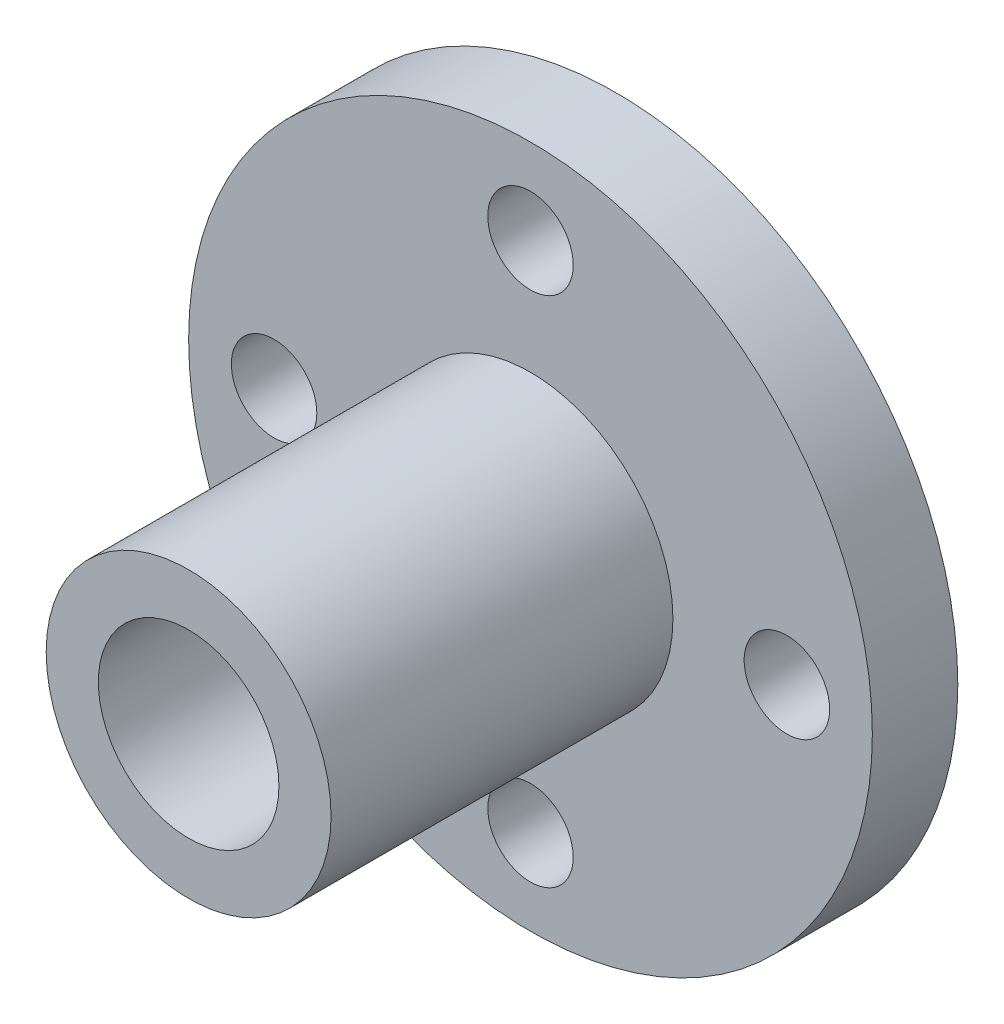
ISO-10303-21;
HEADER;
FILE_DESCRIPTION(('STEP AP214'),'2;1');
FILE_NAME('part.step','',(''),(''),'','','');
FILE_SCHEMA(('AUTOMOTIVE_DESIGN { 1 0 10303 214 1 1 1 1 }'));
ENDSEC;
DATA;
#1=APPLICATION_CONTEXT('core data for automotive mechanical design processes');
#2=APPLICATION_PROTOCOL_DEFINITION('international standard','automotive_design',2000,#1);
#3=PRODUCT_CONTEXT('',#1,'mechanical');
#4=PRODUCT('Part','Part','',(#3));
#5=PRODUCT_RELATED_PRODUCT_CATEGORY('part','',(#4));
#6=PRODUCT_DEFINITION_FORMATION('','',#4);
#7=PRODUCT_DEFINITION_CONTEXT('part definition',#1,'design');
#8=PRODUCT_DEFINITION('design','',#6,#7);
#9=PRODUCT_DEFINITION_SHAPE('','',#8);
#10=(LENGTH_UNIT() NAMED_UNIT(*) SI_UNIT(.MILLI.,.METRE.));
#11=(NAMED_UNIT(*) PLANE_ANGLE_UNIT() SI_UNIT($,.RADIAN.));
#12=(NAMED_UNIT(*) SI_UNIT($,.STERADIAN.) SOLID_ANGLE_UNIT());
#13=UNCERTAINTY_MEASURE_WITH_UNIT(LENGTH_MEASURE(1.E-05),#10,'distance_accuracy_value','');
#14=(GEOMETRIC_REPRESENTATION_CONTEXT(3) GLOBAL_UNCERTAINTY_ASSIGNED_CONTEXT((#13)) GLOBAL_UNIT_ASSIGNED_CONTEXT((#10,
#11,#12)) REPRESENTATION_CONTEXT('',''));
#15=CARTESIAN_POINT('',(0.,0.,0.));
#16=DIRECTION('',(0.,0.,1.));
#17=DIRECTION('',(1.,0.,0.));
#18=AXIS2_PLACEMENT_3D('',#15,#16,#17);
#19=CARTESIAN_POINT('',(0.,0.,3.));
#20=DIRECTION('',(0.,0.,-1.));
#21=DIRECTION('',(-1.,0.,0.));
#22=AXIS2_PLACEMENT_3D('',#19,#20,#21);
#23=CYLINDRICAL_SURFACE('',#22,12.);
#24=CARTESIAN_POINT('',(0.,0.,3.));
#25=DIRECTION('',(0.,0.,1.));
#26=DIRECTION('',(1.,0.,0.));
#27=AXIS2_PLACEMENT_3D('',#24,#25,#26);
#28=CIRCLE('',#27,12.);
#29=CARTESIAN_POINT('',(12.,0.,3.));
#30=VERTEX_POINT('',#29);
#31=EDGE_CURVE('E10',#30,#30,#28,.T.);
#32=ORIENTED_EDGE('',*,*,#31,.F.);
#33=EDGE_LOOP('',(#32));
#34=FACE_BOUND('',#33,.T.);
#35=CARTESIAN_POINT('',(0.,0.,0.));
#36=DIRECTION('',(0.,0.,1.));
#37=DIRECTION('',(1.,0.,0.));
#38=AXIS2_PLACEMENT_3D('',#35,#36,#37);
#39=CIRCLE('',#38,12.);
#40=CARTESIAN_POINT('',(12.,0.,0.));
#41=VERTEX_POINT('',#40);
#42=EDGE_CURVE('E36',#41,#41,#39,.T.);
#43=ORIENTED_EDGE('',*,*,#42,.T.);
#44=EDGE_LOOP('',(#43));
#45=FACE_BOUND('',#44,.T.);
#46=ADVANCED_FACE('F33',(#34,#45),#23,.T.);
#47=CARTESIAN_POINT('',(0.,0.,3.));
#48=DIRECTION('',(0.,0.,1.));
#49=DIRECTION('',(1.,0.,0.));
#50=AXIS2_PLACEMENT_3D('',#47,#48,#49);
#51=PLANE('',#50);
#52=CARTESIAN_POINT('',(-9.,0.,3.));
#53=DIRECTION('',(0.,0.,1.));
#54=DIRECTION('',(1.,0.,0.));
#55=AXIS2_PLACEMENT_3D('',#52,#53,#54);
#56=CIRCLE('',#55,1.5);
#57=CARTESIAN_POINT('',(-7.5,0.,3.));
#58=VERTEX_POINT('',#57);
#59=EDGE_CURVE('E54',#58,#58,#56,.F.);
#60=ORIENTED_EDGE('',*,*,#59,.T.);
#61=EDGE_LOOP('',(#60));
#62=FACE_BOUND('',#61,.T.);
#63=CARTESIAN_POINT('',(0.,9.,3.));
#64=DIRECTION('',(0.,0.,1.));
#65=DIRECTION('',(1.,0.,0.));
#66=AXIS2_PLACEMENT_3D('',#63,#64,#65);
#67=CIRCLE('',#66,1.5);
#68=CARTESIAN_POINT('',(1.50000000000003,9.,3.));
#69=VERTEX_POINT('',#68);
#70=EDGE_CURVE('E59',#69,#69,#67,.F.);
#71=ORIENTED_EDGE('',*,*,#70,.T.);
#72=EDGE_LOOP('',(#71));
#73=FACE_BOUND('',#72,.T.);
#74=CARTESIAN_POINT('',(9.,0.,3.));
#75=DIRECTION('',(0.,0.,1.));
#76=DIRECTION('',(1.,0.,0.));
#77=AXIS2_PLACEMENT_3D('',#74,#75,#76);
#78=CIRCLE('',#77,1.5);
#79=CARTESIAN_POINT('',(10.5,0.,3.));
#80=VERTEX_POINT('',#79);
#81=EDGE_CURVE('E62',#80,#80,#78,.F.);
#82=ORIENTED_EDGE('',*,*,#81,.T.);
#83=EDGE_LOOP('',(#82));
#84=FACE_BOUND('',#83,.T.);
#85=CARTESIAN_POINT('',(0.,-9.,3.));
#86=DIRECTION('',(0.,0.,1.));
#87=DIRECTION('',(1.,0.,0.));
#88=AXIS2_PLACEMENT_3D('',#85,#86,#87);
#89=CIRCLE('',#88,1.5);
#90=CARTESIAN_POINT('',(1.4999999999999,-9.,3.));
#91=VERTEX_POINT('',#90);
#92=EDGE_CURVE('E65',#91,#91,#89,.F.);
#93=ORIENTED_EDGE('',*,*,#92,.T.);
#94=EDGE_LOOP('',(#93));
#95=FACE_BOUND('',#94,.T.);
#96=CARTESIAN_POINT('',(0.,0.,3.));
#97=DIRECTION('',(0.,0.,1.));
#98=DIRECTION('',(1.,0.,0.));
#99=AXIS2_PLACEMENT_3D('',#96,#97,#98);
#100=CIRCLE('',#99,5.);
#101=CARTESIAN_POINT('',(5.,0.,3.));
#102=VERTEX_POINT('',#101);
#103=EDGE_CURVE('E43',#102,#102,#100,.F.);
#104=ORIENTED_EDGE('',*,*,#103,.T.);
#105=EDGE_LOOP('',(#104));
#106=FACE_BOUND('',#105,.T.);
#107=ORIENTED_EDGE('',*,*,#31,.T.);
#108=EDGE_LOOP('',(#107));
#109=FACE_BOUND('',#108,.T.);
#110=ADVANCED_FACE('F97',(#62,#73,#84,#95,#106,#109),#51,.T.);
#111=CARTESIAN_POINT('',(0.,0.,0.));
#112=DIRECTION('',(0.,0.,1.));
#113=DIRECTION('',(1.,0.,0.));
#114=AXIS2_PLACEMENT_3D('',#111,#112,#113);
#115=PLANE('',#114);
#116=CARTESIAN_POINT('',(-9.,0.,0.));
#117=DIRECTION('',(0.,0.,1.));
#118=DIRECTION('',(1.,0.,0.));
#119=AXIS2_PLACEMENT_3D('',#116,#117,#118);
#120=CIRCLE('',#119,1.5);
#121=CARTESIAN_POINT('',(-7.5,0.,0.));
#122=VERTEX_POINT('',#121);
#123=EDGE_CURVE('E68',#122,#122,#120,.T.);
#124=ORIENTED_EDGE('',*,*,#123,.T.);
#125=EDGE_LOOP('',(#124));
#126=FACE_BOUND('',#125,.T.);
#127=CARTESIAN_POINT('',(0.,9.,0.));
#128=DIRECTION('',(0.,0.,1.));
#129=DIRECTION('',(1.,0.,0.));
#130=AXIS2_PLACEMENT_3D('',#127,#128,#129);
#131=CIRCLE('',#130,1.5);
#132=CARTESIAN_POINT('',(1.50000000000003,9.,0.));
#133=VERTEX_POINT('',#132);
#134=EDGE_CURVE('E75',#133,#133,#131,.T.);
#135=ORIENTED_EDGE('',*,*,#134,.T.);
#136=EDGE_LOOP('',(#135));
#137=FACE_BOUND('',#136,.T.);
#138=CARTESIAN_POINT('',(9.,0.,0.));
#139=DIRECTION('',(0.,0.,1.));
#140=DIRECTION('',(1.,0.,0.));
#141=AXIS2_PLACEMENT_3D('',#138,#139,#140);
#142=CIRCLE('',#141,1.5);
#143=CARTESIAN_POINT('',(10.5,0.,0.));
#144=VERTEX_POINT('',#143);
#145=EDGE_CURVE('E72',#144,#144,#142,.T.);
#146=ORIENTED_EDGE('',*,*,#145,.T.);
#147=EDGE_LOOP('',(#146));
#148=FACE_BOUND('',#147,.T.);
#149=CARTESIAN_POINT('',(0.,-9.,0.));
#150=DIRECTION('',(0.,0.,1.));
#151=DIRECTION('',(1.,0.,0.));
#152=AXIS2_PLACEMENT_3D('',#149,#150,#151);
#153=CIRCLE('',#152,1.5);
#154=CARTESIAN_POINT('',(1.4999999999999,-9.,0.));
#155=VERTEX_POINT('',#154);
#156=EDGE_CURVE('E69',#155,#155,#153,.T.);
#157=ORIENTED_EDGE('',*,*,#156,.T.);
#158=EDGE_LOOP('',(#157));
#159=FACE_BOUND('',#158,.T.);
#160=CARTESIAN_POINT('',(0.,0.,0.));
#161=DIRECTION('',(0.,0.,1.));
#162=DIRECTION('',(1.,0.,0.));
#163=AXIS2_PLACEMENT_3D('',#160,#161,#162);
#164=CIRCLE('',#163,3.17);
#165=CARTESIAN_POINT('',(3.17,0.,0.));
#166=VERTEX_POINT('',#165);
#167=EDGE_CURVE('E51',#166,#166,#164,.T.);
#168=ORIENTED_EDGE('',*,*,#167,.T.);
#169=EDGE_LOOP('',(#168));
#170=FACE_BOUND('',#169,.T.);
#171=ORIENTED_EDGE('',*,*,#42,.F.);
#172=EDGE_LOOP('',(#171));
#173=FACE_BOUND('',#172,.T.);
#174=ADVANCED_FACE('F81',(#126,#137,#148,#159,#170,#173),#115,.F.);
#175=CARTESIAN_POINT('',(0.,0.,15.));
#176=DIRECTION('',(0.,0.,-1.));
#177=DIRECTION('',(-1.,0.,0.));
#178=AXIS2_PLACEMENT_3D('',#175,#176,#177);
#179=CYLINDRICAL_SURFACE('',#178,5.);
#180=ORIENTED_EDGE('',*,*,#103,.F.);
#181=EDGE_LOOP('',(#180));
#182=FACE_BOUND('',#181,.T.);
#183=CARTESIAN_POINT('',(0.,0.,15.));
#184=DIRECTION('',(0.,0.,1.));
#185=DIRECTION('',(1.,0.,0.));
#186=AXIS2_PLACEMENT_3D('',#183,#184,#185);
#187=CIRCLE('',#186,5.);
#188=CARTESIAN_POINT('',(5.,0.,15.));
#189=VERTEX_POINT('',#188);
#190=EDGE_CURVE('E47',#189,#189,#187,.T.);
#191=ORIENTED_EDGE('',*,*,#190,.F.);
#192=EDGE_LOOP('',(#191));
#193=FACE_BOUND('',#192,.T.);
#194=ADVANCED_FACE('F108',(#182,#193),#179,.T.);
#195=CARTESIAN_POINT('',(0.,0.,15.));
#196=DIRECTION('',(0.,0.,1.));
#197=DIRECTION('',(1.,0.,0.));
#198=AXIS2_PLACEMENT_3D('',#195,#196,#197);
#199=PLANE('',#198);
#200=CARTESIAN_POINT('',(0.,0.,15.));
#201=DIRECTION('',(0.,0.,1.));
#202=DIRECTION('',(1.,0.,0.));
#203=AXIS2_PLACEMENT_3D('',#200,#201,#202);
#204=CIRCLE('',#203,3.17);
#205=CARTESIAN_POINT('',(3.17,0.,15.));
#206=VERTEX_POINT('',#205);
#207=EDGE_CURVE('E50',#206,#206,#204,.T.);
#208=ORIENTED_EDGE('',*,*,#207,.F.);
#209=EDGE_LOOP('',(#208));
#210=FACE_BOUND('',#209,.T.);
#211=ORIENTED_EDGE('',*,*,#190,.T.);
#212=EDGE_LOOP('',(#211));
#213=FACE_BOUND('',#212,.T.);
#214=ADVANCED_FACE('F112',(#210,#213),#199,.T.);
#215=CARTESIAN_POINT('',(0.,0.,15.));
#216=DIRECTION('',(0.,0.,-1.));
#217=DIRECTION('',(-1.,0.,0.));
#218=AXIS2_PLACEMENT_3D('',#215,#216,#217);
#219=CYLINDRICAL_SURFACE('',#218,3.17);
#220=ORIENTED_EDGE('',*,*,#207,.T.);
#221=EDGE_LOOP('',(#220));
#222=FACE_BOUND('',#221,.T.);
#223=ORIENTED_EDGE('',*,*,#167,.F.);
#224=EDGE_LOOP('',(#223));
#225=FACE_BOUND('',#224,.T.);
#226=ADVANCED_FACE('F118',(#222,#225),#219,.F.);
#227=CARTESIAN_POINT('',(0.,-9.,5.));
#228=DIRECTION('',(0.,0.,-1.));
#229=DIRECTION('',(-1.,0.,0.));
#230=AXIS2_PLACEMENT_3D('',#227,#228,#229);
#231=CYLINDRICAL_SURFACE('',#230,1.5);
#232=ORIENTED_EDGE('',*,*,#92,.F.);
#233=EDGE_LOOP('',(#232));
#234=FACE_BOUND('',#233,.T.);
#235=ORIENTED_EDGE('',*,*,#156,.F.);
#236=EDGE_LOOP('',(#235));
#237=FACE_BOUND('',#236,.T.);
#238=ADVANCED_FACE('F122',(#234,#237),#231,.F.);
#239=CARTESIAN_POINT('',(9.,0.,5.));
#240=DIRECTION('',(0.,0.,-1.));
#241=DIRECTION('',(-1.,0.,0.));
#242=AXIS2_PLACEMENT_3D('',#239,#240,#241);
#243=CYLINDRICAL_SURFACE('',#242,1.5);
#244=ORIENTED_EDGE('',*,*,#81,.F.);
#245=EDGE_LOOP('',(#244));
#246=FACE_BOUND('',#245,.T.);
#247=ORIENTED_EDGE('',*,*,#145,.F.);
#248=EDGE_LOOP('',(#247));
#249=FACE_BOUND('',#248,.T.);
#250=ADVANCED_FACE('F92',(#246,#249),#243,.F.);
#251=CARTESIAN_POINT('',(0.,9.,5.));
#252=DIRECTION('',(0.,0.,-1.));
#253=DIRECTION('',(-1.,0.,0.));
#254=AXIS2_PLACEMENT_3D('',#251,#252,#253);
#255=CYLINDRICAL_SURFACE('',#254,1.5);
#256=ORIENTED_EDGE('',*,*,#70,.F.);
#257=EDGE_LOOP('',(#256));
#258=FACE_BOUND('',#257,.T.);
#259=ORIENTED_EDGE('',*,*,#134,.F.);
#260=EDGE_LOOP('',(#259));
#261=FACE_BOUND('',#260,.T.);
#262=ADVANCED_FACE('F86',(#258,#261),#255,.F.);
#263=CARTESIAN_POINT('',(-9.,0.,5.));
#264=DIRECTION('',(0.,0.,-1.));
#265=DIRECTION('',(-1.,0.,0.));
#266=AXIS2_PLACEMENT_3D('',#263,#264,#265);
#267=CYLINDRICAL_SURFACE('',#266,1.5);
#268=ORIENTED_EDGE('',*,*,#59,.F.);
#269=EDGE_LOOP('',(#268));
#270=FACE_BOUND('',#269,.T.);
#271=ORIENTED_EDGE('',*,*,#123,.F.);
#272=EDGE_LOOP('',(#271));
#273=FACE_BOUND('',#272,.T.);
#274=ADVANCED_FACE('F84',(#270,#273),#267,.F.);
#275=CLOSED_SHELL('',(#46,#110,#174,#194,#214,#226,#238,#250,#262,#274));
#276=MANIFOLD_SOLID_BREP('B2',#275);
#277=ADVANCED_BREP_SHAPE_REPRESENTATION('',(#18,#276),#14);
#278=SHAPE_DEFINITION_REPRESENTATION(#9,#277);
ENDSEC;
END-ISO-10303-21;
